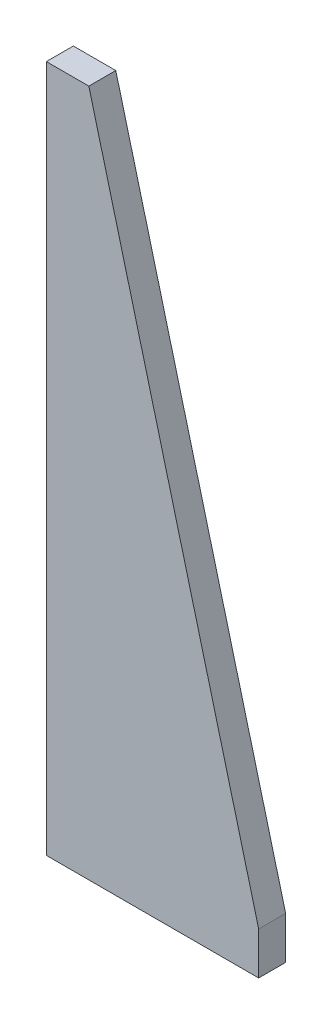
ISO-10303-21;
HEADER;
FILE_DESCRIPTION(('STEP AP214'),'2;1');
FILE_NAME('part.step','',(''),(''),'','','');
FILE_SCHEMA(('AUTOMOTIVE_DESIGN { 1 0 10303 214 1 1 1 1 }'));
ENDSEC;
DATA;
#1=APPLICATION_CONTEXT('core data for automotive mechanical design processes');
#2=APPLICATION_PROTOCOL_DEFINITION('international standard','automotive_design',2000,#1);
#3=PRODUCT_CONTEXT('',#1,'mechanical');
#4=PRODUCT('Part','Part','',(#3));
#5=PRODUCT_RELATED_PRODUCT_CATEGORY('part','',(#4));
#6=PRODUCT_DEFINITION_FORMATION('','',#4);
#7=PRODUCT_DEFINITION_CONTEXT('part definition',#1,'design');
#8=PRODUCT_DEFINITION('design','',#6,#7);
#9=PRODUCT_DEFINITION_SHAPE('','',#8);
#10=(LENGTH_UNIT() NAMED_UNIT(*) SI_UNIT(.MILLI.,.METRE.));
#11=(NAMED_UNIT(*) PLANE_ANGLE_UNIT() SI_UNIT($,.RADIAN.));
#12=(NAMED_UNIT(*) SI_UNIT($,.STERADIAN.) SOLID_ANGLE_UNIT());
#13=UNCERTAINTY_MEASURE_WITH_UNIT(LENGTH_MEASURE(1.E-05),#10,'distance_accuracy_value','');
#14=(GEOMETRIC_REPRESENTATION_CONTEXT(3) GLOBAL_UNCERTAINTY_ASSIGNED_CONTEXT((#13)) GLOBAL_UNIT_ASSIGNED_CONTEXT((#10,
#11,#12)) REPRESENTATION_CONTEXT('',''));
#15=CARTESIAN_POINT('',(0.,0.,0.));
#16=DIRECTION('',(0.,0.,1.));
#17=DIRECTION('',(1.,0.,0.));
#18=AXIS2_PLACEMENT_3D('',#15,#16,#17);
#19=CARTESIAN_POINT('',(0.,161.89,-6.35));
#20=DIRECTION('',(-1.,0.,0.));
#21=DIRECTION('',(0.,-1.,0.));
#22=AXIS2_PLACEMENT_3D('',#19,#20,#21);
#23=PLANE('',#22);
#24=DIRECTION('',(0.,-1.,0.));
#25=VECTOR('',#24,1.);
#26=CARTESIAN_POINT('',(0.,161.89,0.));
#27=LINE('',#26,#25);
#28=CARTESIAN_POINT('',(0.,161.89,0.));
#29=VERTEX_POINT('',#28);
#30=CARTESIAN_POINT('',(0.,0.,0.));
#31=VERTEX_POINT('',#30);
#32=EDGE_CURVE('E118',#29,#31,#27,.T.);
#33=ORIENTED_EDGE('',*,*,#32,.F.);
#34=DIRECTION('',(0.,0.,1.));
#35=VECTOR('',#34,1.);
#36=CARTESIAN_POINT('',(0.,161.89,-6.35));
#37=LINE('',#36,#35);
#38=CARTESIAN_POINT('',(0.,161.89,-6.35));
#39=VERTEX_POINT('',#38);
#40=EDGE_CURVE('E11',#39,#29,#37,.T.);
#41=ORIENTED_EDGE('',*,*,#40,.F.);
#42=DIRECTION('',(0.,-1.,0.));
#43=VECTOR('',#42,1.);
#44=CARTESIAN_POINT('',(0.,161.89,-6.35));
#45=LINE('',#44,#43);
#46=CARTESIAN_POINT('',(0.,0.,-6.35));
#47=VERTEX_POINT('',#46);
#48=EDGE_CURVE('E113',#39,#47,#45,.T.);
#49=ORIENTED_EDGE('',*,*,#48,.T.);
#50=DIRECTION('',(0.,0.,1.));
#51=VECTOR('',#50,1.);
#52=CARTESIAN_POINT('',(0.,0.,-6.35));
#53=LINE('',#52,#51);
#54=EDGE_CURVE('E44',#47,#31,#53,.T.);
#55=ORIENTED_EDGE('',*,*,#54,.T.);
#56=EDGE_LOOP('',(#33,#41,#49,#55));
#57=FACE_BOUND('',#56,.T.);
#58=ADVANCED_FACE('F41',(#57),#23,.T.);
#59=CARTESIAN_POINT('',(10.,161.89,-6.35));
#60=DIRECTION('',(0.,1.,0.));
#61=DIRECTION('',(0.,0.,1.));
#62=AXIS2_PLACEMENT_3D('',#59,#60,#61);
#63=PLANE('',#62);
#64=DIRECTION('',(-1.,0.,0.));
#65=VECTOR('',#64,1.);
#66=CARTESIAN_POINT('',(10.,161.89,0.));
#67=LINE('',#66,#65);
#68=CARTESIAN_POINT('',(10.,161.89,0.));
#69=VERTEX_POINT('',#68);
#70=EDGE_CURVE('E127',#69,#29,#67,.T.);
#71=ORIENTED_EDGE('',*,*,#70,.F.);
#72=DIRECTION('',(0.,0.,1.));
#73=VECTOR('',#72,1.);
#74=CARTESIAN_POINT('',(10.,161.89,-6.35));
#75=LINE('',#74,#73);
#76=CARTESIAN_POINT('',(10.,161.89,-6.35));
#77=VERTEX_POINT('',#76);
#78=EDGE_CURVE('E50',#77,#69,#75,.T.);
#79=ORIENTED_EDGE('',*,*,#78,.F.);
#80=DIRECTION('',(-1.,0.,0.));
#81=VECTOR('',#80,1.);
#82=CARTESIAN_POINT('',(10.,161.89,-6.35));
#83=LINE('',#82,#81);
#84=EDGE_CURVE('E108',#77,#39,#83,.T.);
#85=ORIENTED_EDGE('',*,*,#84,.T.);
#86=ORIENTED_EDGE('',*,*,#40,.T.);
#87=EDGE_LOOP('',(#71,#79,#85,#86));
#88=FACE_BOUND('',#87,.T.);
#89=ADVANCED_FACE('F133',(#88),#63,.T.);
#90=CARTESIAN_POINT('',(50.,10.,-6.35));
#91=DIRECTION('',(0.96702916370616,0.254665656384531,0.));
#92=DIRECTION('',(-0.254665656384531,0.96702916370616,0.));
#93=AXIS2_PLACEMENT_3D('',#90,#91,#92);
#94=PLANE('',#93);
#95=DIRECTION('',(-0.254665656384531,0.96702916370616,0.));
#96=VECTOR('',#95,1.);
#97=CARTESIAN_POINT('',(50.,10.,0.));
#98=LINE('',#97,#96);
#99=CARTESIAN_POINT('',(50.,10.,0.));
#100=VERTEX_POINT('',#99);
#101=EDGE_CURVE('E97',#100,#69,#98,.T.);
#102=ORIENTED_EDGE('',*,*,#101,.F.);
#103=DIRECTION('',(0.,0.,1.));
#104=VECTOR('',#103,1.);
#105=CARTESIAN_POINT('',(50.,10.,-6.35));
#106=LINE('',#105,#104);
#107=CARTESIAN_POINT('',(50.,10.,-6.35));
#108=VERTEX_POINT('',#107);
#109=EDGE_CURVE('E92',#108,#100,#106,.T.);
#110=ORIENTED_EDGE('',*,*,#109,.F.);
#111=DIRECTION('',(-0.254665656384531,0.96702916370616,0.));
#112=VECTOR('',#111,1.);
#113=CARTESIAN_POINT('',(50.,10.,-6.35));
#114=LINE('',#113,#112);
#115=EDGE_CURVE('E95',#108,#77,#114,.T.);
#116=ORIENTED_EDGE('',*,*,#115,.T.);
#117=ORIENTED_EDGE('',*,*,#78,.T.);
#118=EDGE_LOOP('',(#102,#110,#116,#117));
#119=FACE_BOUND('',#118,.T.);
#120=ADVANCED_FACE('F94',(#119),#94,.T.);
#121=CARTESIAN_POINT('',(50.,0.,-6.35));
#122=DIRECTION('',(1.,0.,0.));
#123=DIRECTION('',(0.,0.,-1.));
#124=AXIS2_PLACEMENT_3D('',#121,#122,#123);
#125=PLANE('',#124);
#126=DIRECTION('',(0.,1.,0.));
#127=VECTOR('',#126,1.);
#128=CARTESIAN_POINT('',(50.,0.,0.));
#129=LINE('',#128,#127);
#130=CARTESIAN_POINT('',(50.,0.,0.));
#131=VERTEX_POINT('',#130);
#132=EDGE_CURVE('E124',#131,#100,#129,.T.);
#133=ORIENTED_EDGE('',*,*,#132,.F.);
#134=DIRECTION('',(0.,0.,1.));
#135=VECTOR('',#134,1.);
#136=CARTESIAN_POINT('',(50.,0.,-6.35));
#137=LINE('',#136,#135);
#138=CARTESIAN_POINT('',(50.,0.,-6.35));
#139=VERTEX_POINT('',#138);
#140=EDGE_CURVE('E102',#139,#131,#137,.T.);
#141=ORIENTED_EDGE('',*,*,#140,.F.);
#142=DIRECTION('',(0.,1.,0.));
#143=VECTOR('',#142,1.);
#144=CARTESIAN_POINT('',(50.,0.,-6.35));
#145=LINE('',#144,#143);
#146=EDGE_CURVE('E107',#139,#108,#145,.T.);
#147=ORIENTED_EDGE('',*,*,#146,.T.);
#148=ORIENTED_EDGE('',*,*,#109,.T.);
#149=EDGE_LOOP('',(#133,#141,#147,#148));
#150=FACE_BOUND('',#149,.T.);
#151=ADVANCED_FACE('F110',(#150),#125,.T.);
#152=CARTESIAN_POINT('',(0.,0.,-6.35));
#153=DIRECTION('',(0.,-1.,0.));
#154=DIRECTION('',(0.,0.,-1.));
#155=AXIS2_PLACEMENT_3D('',#152,#153,#154);
#156=PLANE('',#155);
#157=DIRECTION('',(1.,0.,0.));
#158=VECTOR('',#157,1.);
#159=CARTESIAN_POINT('',(0.,0.,0.));
#160=LINE('',#159,#158);
#161=EDGE_CURVE('E121',#31,#131,#160,.T.);
#162=ORIENTED_EDGE('',*,*,#161,.F.);
#163=ORIENTED_EDGE('',*,*,#54,.F.);
#164=DIRECTION('',(1.,0.,0.));
#165=VECTOR('',#164,1.);
#166=CARTESIAN_POINT('',(0.,0.,-6.35));
#167=LINE('',#166,#165);
#168=EDGE_CURVE('E111',#47,#139,#167,.T.);
#169=ORIENTED_EDGE('',*,*,#168,.T.);
#170=ORIENTED_EDGE('',*,*,#140,.T.);
#171=EDGE_LOOP('',(#162,#163,#169,#170));
#172=FACE_BOUND('',#171,.T.);
#173=ADVANCED_FACE('F130',(#172),#156,.T.);
#174=CARTESIAN_POINT('',(0.,0.,-6.35));
#175=DIRECTION('',(0.,0.,1.));
#176=DIRECTION('',(1.,0.,0.));
#177=AXIS2_PLACEMENT_3D('',#174,#175,#176);
#178=PLANE('',#177);
#179=ORIENTED_EDGE('',*,*,#48,.F.);
#180=ORIENTED_EDGE('',*,*,#84,.F.);
#181=ORIENTED_EDGE('',*,*,#115,.F.);
#182=ORIENTED_EDGE('',*,*,#146,.F.);
#183=ORIENTED_EDGE('',*,*,#168,.F.);
#184=EDGE_LOOP('',(#179,#180,#181,#182,#183));
#185=FACE_BOUND('',#184,.T.);
#186=ADVANCED_FACE('F106',(#185),#178,.F.);
#187=CARTESIAN_POINT('',(0.,0.,0.));
#188=DIRECTION('',(0.,0.,1.));
#189=DIRECTION('',(1.,0.,0.));
#190=AXIS2_PLACEMENT_3D('',#187,#188,#189);
#191=PLANE('',#190);
#192=ORIENTED_EDGE('',*,*,#32,.T.);
#193=ORIENTED_EDGE('',*,*,#161,.T.);
#194=ORIENTED_EDGE('',*,*,#132,.T.);
#195=ORIENTED_EDGE('',*,*,#101,.T.);
#196=ORIENTED_EDGE('',*,*,#70,.T.);
#197=EDGE_LOOP('',(#192,#193,#194,#195,#196));
#198=FACE_BOUND('',#197,.T.);
#199=ADVANCED_FACE('F132',(#198),#191,.T.);
#200=CLOSED_SHELL('',(#58,#89,#120,#151,#173,#186,#199));
#201=MANIFOLD_SOLID_BREP('B2',#200);
#202=ADVANCED_BREP_SHAPE_REPRESENTATION('',(#18,#201),#14);
#203=SHAPE_DEFINITION_REPRESENTATION(#9,#202);
ENDSEC;
END-ISO-10303-21;
